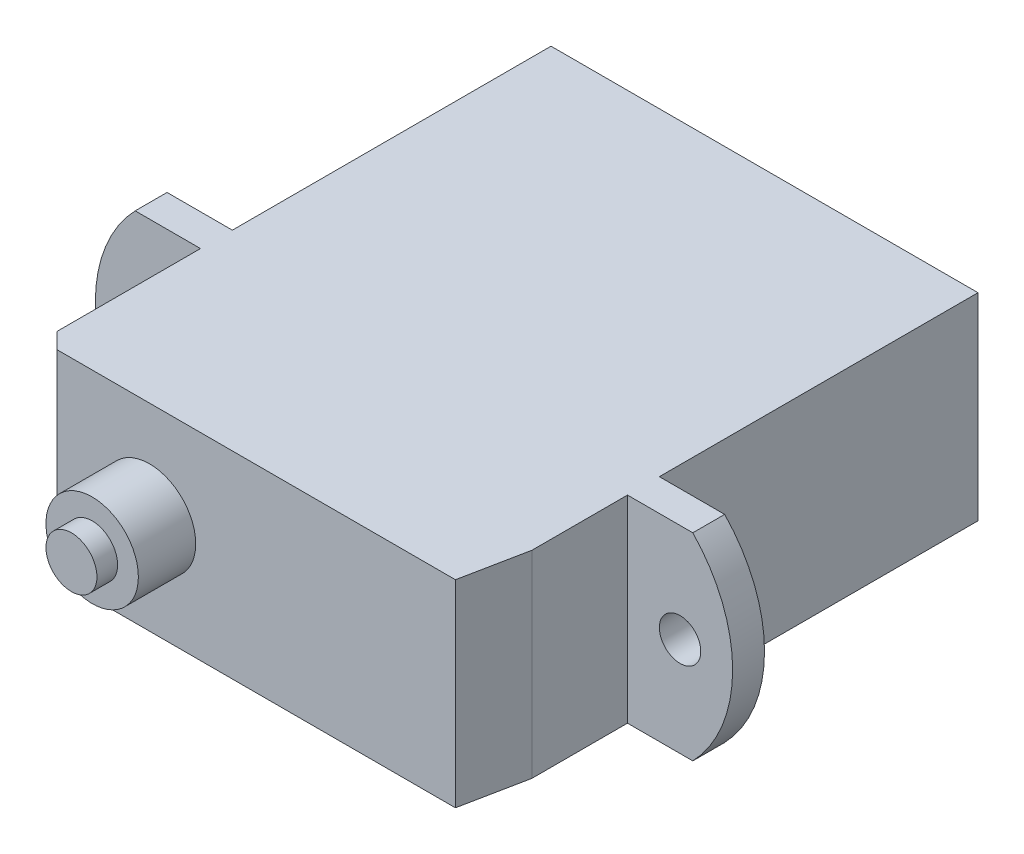
ISO-10303-21;
HEADER;
FILE_DESCRIPTION(('STEP AP214'),'2;1');
FILE_NAME('part.step','',(''),(''),'','','');
FILE_SCHEMA(('AUTOMOTIVE_DESIGN { 1 0 10303 214 1 1 1 1 }'));
ENDSEC;
DATA;
#1=APPLICATION_CONTEXT('core data for automotive mechanical design processes');
#2=APPLICATION_PROTOCOL_DEFINITION('international standard','automotive_design',2000,#1);
#3=PRODUCT_CONTEXT('',#1,'mechanical');
#4=PRODUCT('Part','Part','',(#3));
#5=PRODUCT_RELATED_PRODUCT_CATEGORY('part','',(#4));
#6=PRODUCT_DEFINITION_FORMATION('','',#4);
#7=PRODUCT_DEFINITION_CONTEXT('part definition',#1,'design');
#8=PRODUCT_DEFINITION('design','',#6,#7);
#9=PRODUCT_DEFINITION_SHAPE('','',#8);
#10=(LENGTH_UNIT() NAMED_UNIT(*) SI_UNIT(.MILLI.,.METRE.));
#11=(NAMED_UNIT(*) PLANE_ANGLE_UNIT() SI_UNIT($,.RADIAN.));
#12=(NAMED_UNIT(*) SI_UNIT($,.STERADIAN.) SOLID_ANGLE_UNIT());
#13=UNCERTAINTY_MEASURE_WITH_UNIT(LENGTH_MEASURE(1.E-05),#10,'distance_accuracy_value','');
#14=(GEOMETRIC_REPRESENTATION_CONTEXT(3) GLOBAL_UNCERTAINTY_ASSIGNED_CONTEXT((#13)) GLOBAL_UNIT_ASSIGNED_CONTEXT((#10,
#11,#12)) REPRESENTATION_CONTEXT('',''));
#15=CARTESIAN_POINT('',(0.,0.,0.));
#16=DIRECTION('',(0.,0.,1.));
#17=DIRECTION('',(1.,0.,0.));
#18=AXIS2_PLACEMENT_3D('',#15,#16,#17);
#19=CARTESIAN_POINT('',(-8.3,0.,0.3));
#20=DIRECTION('',(1.,0.,0.));
#21=DIRECTION('',(0.,0.,-1.));
#22=AXIS2_PLACEMENT_3D('',#19,#20,#21);
#23=PLANE('',#22);
#24=CARTESIAN_POINT('',(-8.3,0.,0.3));
#25=DIRECTION('',(-1.,0.,0.));
#26=DIRECTION('',(0.,0.,1.));
#27=AXIS2_PLACEMENT_3D('',#24,#25,#26);
#28=CIRCLE('',#27,0.3);
#29=CARTESIAN_POINT('',(-8.3,-0.3,0.299999999925));
#30=VERTEX_POINT('',#29);
#31=CARTESIAN_POINT('',(-8.3,0.3,0.3));
#32=VERTEX_POINT('',#31);
#33=EDGE_CURVE('E19',#30,#32,#28,.T.);
#34=ORIENTED_EDGE('',*,*,#33,.T.);
#35=CARTESIAN_POINT('',(-8.3,0.,0.3));
#36=DIRECTION('',(-1.,0.,0.));
#37=DIRECTION('',(0.,0.,1.));
#38=AXIS2_PLACEMENT_3D('',#35,#36,#37);
#39=CIRCLE('',#38,0.3);
#40=EDGE_CURVE('E64',#32,#30,#39,.T.);
#41=ORIENTED_EDGE('',*,*,#40,.T.);
#42=EDGE_LOOP('',(#34,#41));
#43=FACE_BOUND('',#42,.T.);
#44=ADVANCED_FACE('F16',(#43),#23,.F.);
#45=CARTESIAN_POINT('',(-8.3,0.6,0.3));
#46=DIRECTION('',(1.,0.,0.));
#47=DIRECTION('',(0.,0.,-1.));
#48=AXIS2_PLACEMENT_3D('',#45,#46,#47);
#49=PLANE('',#48);
#50=CARTESIAN_POINT('',(-8.3,0.599999999999999,0.3));
#51=DIRECTION('',(-1.,0.,0.));
#52=DIRECTION('',(0.,0.,1.));
#53=AXIS2_PLACEMENT_3D('',#50,#51,#52);
#54=CIRCLE('',#53,0.3);
#55=CARTESIAN_POINT('',(-8.3,0.299999999999999,0.3));
#56=VERTEX_POINT('',#55);
#57=EDGE_CURVE('E85',#56,#56,#54,.T.);
#58=ORIENTED_EDGE('',*,*,#57,.T.);
#59=EDGE_LOOP('',(#58));
#60=FACE_BOUND('',#59,.T.);
#61=ADVANCED_FACE('F745',(#60),#49,.F.);
#62=CARTESIAN_POINT('',(-7.3,0.,0.3));
#63=DIRECTION('',(-1.,0.,0.));
#64=DIRECTION('',(0.,0.,1.));
#65=AXIS2_PLACEMENT_3D('',#62,#63,#64);
#66=CYLINDRICAL_SURFACE('',#65,0.3);
#67=DIRECTION('',(-1.,0.,0.));
#68=VECTOR('',#67,1.);
#69=CARTESIAN_POINT('',(-7.3,-0.3,0.3));
#70=LINE('',#69,#68);
#71=CARTESIAN_POINT('',(-7.3,-0.3,0.299999999925));
#72=VERTEX_POINT('',#71);
#73=EDGE_CURVE('E76',#72,#30,#70,.T.);
#74=ORIENTED_EDGE('',*,*,#73,.F.);
#75=CARTESIAN_POINT('',(-7.3,0.,0.3));
#76=DIRECTION('',(-1.,0.,0.));
#77=DIRECTION('',(0.,0.,1.));
#78=AXIS2_PLACEMENT_3D('',#75,#76,#77);
#79=CIRCLE('',#78,0.3);
#80=CARTESIAN_POINT('',(-7.3,0.299999999999999,0.299999999925));
#81=VERTEX_POINT('',#80);
#82=EDGE_CURVE('E73',#81,#72,#79,.F.);
#83=ORIENTED_EDGE('',*,*,#82,.F.);
#84=DIRECTION('',(-1.,0.,0.));
#85=VECTOR('',#84,1.);
#86=CARTESIAN_POINT('',(-7.3,0.3,0.3));
#87=LINE('',#86,#85);
#88=EDGE_CURVE('E71',#81,#32,#87,.T.);
#89=ORIENTED_EDGE('',*,*,#88,.T.);
#90=ORIENTED_EDGE('',*,*,#33,.F.);
#91=EDGE_LOOP('',(#74,#83,#89,#90));
#92=FACE_BOUND('',#91,.T.);
#93=ADVANCED_FACE('F72',(#92),#66,.T.);
#94=CARTESIAN_POINT('',(-7.3,0.,0.3));
#95=DIRECTION('',(-1.,0.,0.));
#96=DIRECTION('',(0.,0.,1.));
#97=AXIS2_PLACEMENT_3D('',#94,#95,#96);
#98=CYLINDRICAL_SURFACE('',#97,0.3);
#99=ORIENTED_EDGE('',*,*,#40,.F.);
#100=ORIENTED_EDGE('',*,*,#88,.F.);
#101=CARTESIAN_POINT('',(-7.3,0.,0.3));
#102=DIRECTION('',(-1.,0.,0.));
#103=DIRECTION('',(0.,0.,1.));
#104=AXIS2_PLACEMENT_3D('',#101,#102,#103);
#105=CIRCLE('',#104,0.3);
#106=CARTESIAN_POINT('',(-7.3,0.,0.));
#107=VERTEX_POINT('',#106);
#108=EDGE_CURVE('E97',#107,#81,#105,.F.);
#109=ORIENTED_EDGE('',*,*,#108,.F.);
#110=CARTESIAN_POINT('',(-7.3,0.,0.3));
#111=DIRECTION('',(-1.,0.,0.));
#112=DIRECTION('',(0.,0.,1.));
#113=AXIS2_PLACEMENT_3D('',#110,#111,#112);
#114=CIRCLE('',#113,0.3);
#115=EDGE_CURVE('E88',#72,#107,#114,.F.);
#116=ORIENTED_EDGE('',*,*,#115,.F.);
#117=ORIENTED_EDGE('',*,*,#73,.T.);
#118=EDGE_LOOP('',(#99,#100,#109,#116,#117));
#119=FACE_BOUND('',#118,.T.);
#120=ADVANCED_FACE('F78',(#119),#98,.T.);
#121=CARTESIAN_POINT('',(-7.3,0.599999999999999,0.3));
#122=DIRECTION('',(-1.,0.,0.));
#123=DIRECTION('',(0.,0.,1.));
#124=AXIS2_PLACEMENT_3D('',#121,#122,#123);
#125=CYLINDRICAL_SURFACE('',#124,0.3);
#126=DIRECTION('',(-1.,0.,0.));
#127=VECTOR('',#126,1.);
#128=CARTESIAN_POINT('',(-7.3,0.299999999999999,0.3));
#129=LINE('',#128,#127);
#130=EDGE_CURVE('E82',#81,#56,#129,.T.);
#131=ORIENTED_EDGE('',*,*,#130,.T.);
#132=ORIENTED_EDGE('',*,*,#57,.F.);
#133=ORIENTED_EDGE('',*,*,#130,.F.);
#134=CARTESIAN_POINT('',(-7.3,0.599999999999999,0.3));
#135=DIRECTION('',(-1.,0.,0.));
#136=DIRECTION('',(0.,0.,1.));
#137=AXIS2_PLACEMENT_3D('',#134,#135,#136);
#138=CIRCLE('',#137,0.3);
#139=CARTESIAN_POINT('',(-7.3,0.599999999999999,0.));
#140=VERTEX_POINT('',#139);
#141=EDGE_CURVE('E92',#140,#81,#138,.F.);
#142=ORIENTED_EDGE('',*,*,#141,.F.);
#143=CARTESIAN_POINT('',(-7.3,0.599999999999999,0.3));
#144=DIRECTION('',(-1.,0.,0.));
#145=DIRECTION('',(0.,0.,1.));
#146=AXIS2_PLACEMENT_3D('',#143,#144,#145);
#147=CIRCLE('',#146,0.3);
#148=EDGE_CURVE('E99',#81,#140,#147,.F.);
#149=ORIENTED_EDGE('',*,*,#148,.F.);
#150=EDGE_LOOP('',(#131,#132,#133,#142,#149));
#151=FACE_BOUND('',#150,.T.);
#152=ADVANCED_FACE('F420',(#151),#125,.T.);
#153=CARTESIAN_POINT('',(-8.3,-0.6,0.3));
#154=DIRECTION('',(1.,0.,0.));
#155=DIRECTION('',(0.,0.,-1.));
#156=AXIS2_PLACEMENT_3D('',#153,#154,#155);
#157=PLANE('',#156);
#158=CARTESIAN_POINT('',(-8.3,-0.600000000000001,0.3));
#159=DIRECTION('',(-1.,0.,0.));
#160=DIRECTION('',(0.,0.,1.));
#161=AXIS2_PLACEMENT_3D('',#158,#159,#160);
#162=CIRCLE('',#161,0.3);
#163=CARTESIAN_POINT('',(-8.3,-0.300000000000001,0.3));
#164=VERTEX_POINT('',#163);
#165=EDGE_CURVE('E107',#164,#164,#162,.T.);
#166=ORIENTED_EDGE('',*,*,#165,.T.);
#167=EDGE_LOOP('',(#166));
#168=FACE_BOUND('',#167,.T.);
#169=ADVANCED_FACE('F418',(#168),#157,.F.);
#170=CARTESIAN_POINT('',(-7.3,0.,2.15));
#171=DIRECTION('',(-1.,0.,0.));
#172=DIRECTION('',(0.,0.,1.));
#173=AXIS2_PLACEMENT_3D('',#170,#171,#172);
#174=PLANE('',#173);
#175=DIRECTION('',(0.,1.,0.));
#176=VECTOR('',#175,1.);
#177=CARTESIAN_POINT('',(-7.3,0.,0.));
#178=LINE('',#177,#176);
#179=CARTESIAN_POINT('',(-7.3,-0.600000000000001,0.));
#180=VERTEX_POINT('',#179);
#181=EDGE_CURVE('E87',#107,#180,#178,.F.);
#182=ORIENTED_EDGE('',*,*,#181,.T.);
#183=CARTESIAN_POINT('',(-7.3,-0.600000000000001,0.3));
#184=DIRECTION('',(-1.,0.,0.));
#185=DIRECTION('',(0.,0.,1.));
#186=AXIS2_PLACEMENT_3D('',#183,#184,#185);
#187=CIRCLE('',#186,0.3);
#188=EDGE_CURVE('E25',#72,#180,#187,.T.);
#189=ORIENTED_EDGE('',*,*,#188,.F.);
#190=ORIENTED_EDGE('',*,*,#115,.T.);
#191=EDGE_LOOP('',(#182,#189,#190));
#192=FACE_BOUND('',#191,.T.);
#193=ADVANCED_FACE('F412',(#192),#174,.T.);
#194=CARTESIAN_POINT('',(0.,0.,0.));
#195=DIRECTION('',(0.,0.,1.));
#196=DIRECTION('',(1.,0.,0.));
#197=AXIS2_PLACEMENT_3D('',#194,#195,#196);
#198=PLANE('',#197);
#199=DIRECTION('',(1.,0.,0.));
#200=VECTOR('',#199,1.);
#201=CARTESIAN_POINT('',(0.,-3.1,0.));
#202=LINE('',#201,#200);
#203=CARTESIAN_POINT('',(-6.7,-3.1,0.));
#204=VERTEX_POINT('',#203);
#205=CARTESIAN_POINT('',(6.7,-3.1,0.));
#206=VERTEX_POINT('',#205);
#207=EDGE_CURVE('E91',#204,#206,#202,.T.);
#208=ORIENTED_EDGE('',*,*,#207,.F.);
#209=DIRECTION('',(0.,1.,0.));
#210=VECTOR('',#209,1.);
#211=CARTESIAN_POINT('',(-6.7,-3.1,0.));
#212=LINE('',#211,#210);
#213=CARTESIAN_POINT('',(-6.7,-1.375,0.));
#214=VERTEX_POINT('',#213);
#215=EDGE_CURVE('E294',#204,#214,#212,.T.);
#216=ORIENTED_EDGE('',*,*,#215,.T.);
#217=DIRECTION('',(1.,0.,0.));
#218=VECTOR('',#217,1.);
#219=CARTESIAN_POINT('',(0.,-1.375,0.));
#220=LINE('',#219,#218);
#221=CARTESIAN_POINT('',(-7.3,-1.375,0.));
#222=VERTEX_POINT('',#221);
#223=EDGE_CURVE('E121',#222,#214,#220,.T.);
#224=ORIENTED_EDGE('',*,*,#223,.F.);
#225=DIRECTION('',(0.,1.,0.));
#226=VECTOR('',#225,1.);
#227=CARTESIAN_POINT('',(-7.3,0.,0.));
#228=LINE('',#227,#226);
#229=EDGE_CURVE('E119',#180,#222,#228,.F.);
#230=ORIENTED_EDGE('',*,*,#229,.F.);
#231=ORIENTED_EDGE('',*,*,#181,.F.);
#232=DIRECTION('',(0.,1.,0.));
#233=VECTOR('',#232,1.);
#234=CARTESIAN_POINT('',(-7.3,0.,0.));
#235=LINE('',#234,#233);
#236=EDGE_CURVE('E116',#140,#107,#235,.F.);
#237=ORIENTED_EDGE('',*,*,#236,.F.);
#238=DIRECTION('',(0.,1.,0.));
#239=VECTOR('',#238,1.);
#240=CARTESIAN_POINT('',(-7.3,0.,0.));
#241=LINE('',#240,#239);
#242=CARTESIAN_POINT('',(-7.3,1.375,0.));
#243=VERTEX_POINT('',#242);
#244=EDGE_CURVE('E112',#243,#140,#241,.F.);
#245=ORIENTED_EDGE('',*,*,#244,.F.);
#246=DIRECTION('',(1.,0.,0.));
#247=VECTOR('',#246,1.);
#248=CARTESIAN_POINT('',(0.,1.375,0.));
#249=LINE('',#248,#247);
#250=CARTESIAN_POINT('',(-6.7,1.375,0.));
#251=VERTEX_POINT('',#250);
#252=EDGE_CURVE('E115',#251,#243,#249,.F.);
#253=ORIENTED_EDGE('',*,*,#252,.F.);
#254=DIRECTION('',(0.,1.,0.));
#255=VECTOR('',#254,1.);
#256=CARTESIAN_POINT('',(-6.7,-3.1,0.));
#257=LINE('',#256,#255);
#258=CARTESIAN_POINT('',(-6.7,3.1,0.));
#259=VERTEX_POINT('',#258);
#260=EDGE_CURVE('E287',#251,#259,#257,.T.);
#261=ORIENTED_EDGE('',*,*,#260,.T.);
#262=DIRECTION('',(-1.,0.,0.));
#263=VECTOR('',#262,1.);
#264=CARTESIAN_POINT('',(8.75000000000002,3.1,0.));
#265=LINE('',#264,#263);
#266=CARTESIAN_POINT('',(6.7,3.1,0.));
#267=VERTEX_POINT('',#266);
#268=EDGE_CURVE('E284',#267,#259,#265,.T.);
#269=ORIENTED_EDGE('',*,*,#268,.F.);
#270=DIRECTION('',(0.,1.,0.));
#271=VECTOR('',#270,1.);
#272=CARTESIAN_POINT('',(6.7,0.,0.));
#273=LINE('',#272,#271);
#274=EDGE_CURVE('E281',#206,#267,#273,.T.);
#275=ORIENTED_EDGE('',*,*,#274,.F.);
#276=EDGE_LOOP('',(#208,#216,#224,#230,#231,#237,#245,#253,#261,#269,#275));
#277=FACE_BOUND('',#276,.T.);
#278=ADVANCED_FACE('F311',(#277),#198,.F.);
#279=CARTESIAN_POINT('',(-7.3,0.,2.15));
#280=DIRECTION('',(-1.,0.,0.));
#281=DIRECTION('',(0.,0.,1.));
#282=AXIS2_PLACEMENT_3D('',#279,#280,#281);
#283=PLANE('',#282);
#284=DIRECTION('',(0.,0.,1.));
#285=VECTOR('',#284,1.);
#286=CARTESIAN_POINT('',(-7.3,1.375,4.3));
#287=LINE('',#286,#285);
#288=CARTESIAN_POINT('',(-7.3,1.375,4.3));
#289=VERTEX_POINT('',#288);
#290=EDGE_CURVE('E94',#243,#289,#287,.T.);
#291=ORIENTED_EDGE('',*,*,#290,.F.);
#292=ORIENTED_EDGE('',*,*,#244,.T.);
#293=ORIENTED_EDGE('',*,*,#141,.T.);
#294=ORIENTED_EDGE('',*,*,#82,.T.);
#295=CARTESIAN_POINT('',(-7.3,-0.600000000000001,0.3));
#296=DIRECTION('',(-1.,0.,0.));
#297=DIRECTION('',(0.,0.,1.));
#298=AXIS2_PLACEMENT_3D('',#295,#296,#297);
#299=CIRCLE('',#298,0.3);
#300=EDGE_CURVE('E11',#180,#72,#299,.T.);
#301=ORIENTED_EDGE('',*,*,#300,.F.);
#302=ORIENTED_EDGE('',*,*,#229,.T.);
#303=DIRECTION('',(0.,0.,-1.));
#304=VECTOR('',#303,1.);
#305=CARTESIAN_POINT('',(-7.3,-1.375,0.));
#306=LINE('',#305,#304);
#307=CARTESIAN_POINT('',(-7.3,-1.375,4.3));
#308=VERTEX_POINT('',#307);
#309=EDGE_CURVE('E96',#308,#222,#306,.T.);
#310=ORIENTED_EDGE('',*,*,#309,.F.);
#311=DIRECTION('',(0.,1.,0.));
#312=VECTOR('',#311,1.);
#313=CARTESIAN_POINT('',(-7.3,-1.375,4.3));
#314=LINE('',#313,#312);
#315=EDGE_CURVE('E100',#289,#308,#314,.F.);
#316=ORIENTED_EDGE('',*,*,#315,.F.);
#317=EDGE_LOOP('',(#291,#292,#293,#294,#301,#302,#310,#316));
#318=FACE_BOUND('',#317,.T.);
#319=ADVANCED_FACE('F407',(#318),#283,.T.);
#320=CARTESIAN_POINT('',(-7.3,0.,2.15));
#321=DIRECTION('',(-1.,0.,0.));
#322=DIRECTION('',(0.,0.,1.));
#323=AXIS2_PLACEMENT_3D('',#320,#321,#322);
#324=PLANE('',#323);
#325=ORIENTED_EDGE('',*,*,#236,.T.);
#326=ORIENTED_EDGE('',*,*,#108,.T.);
#327=ORIENTED_EDGE('',*,*,#148,.T.);
#328=EDGE_LOOP('',(#325,#326,#327));
#329=FACE_BOUND('',#328,.T.);
#330=ADVANCED_FACE('F444',(#329),#324,.T.);
#331=CARTESIAN_POINT('',(-6.7,1.375,4.3));
#332=DIRECTION('',(0.,1.,0.));
#333=DIRECTION('',(0.,0.,1.));
#334=AXIS2_PLACEMENT_3D('',#331,#332,#333);
#335=PLANE('',#334);
#336=ORIENTED_EDGE('',*,*,#290,.T.);
#337=DIRECTION('',(1.,0.,0.));
#338=VECTOR('',#337,1.);
#339=CARTESIAN_POINT('',(-6.7,1.375,4.3));
#340=LINE('',#339,#338);
#341=CARTESIAN_POINT('',(-6.7,1.375,4.3));
#342=VERTEX_POINT('',#341);
#343=EDGE_CURVE('E103',#289,#342,#340,.T.);
#344=ORIENTED_EDGE('',*,*,#343,.T.);
#345=DIRECTION('',(0.,0.,-1.));
#346=VECTOR('',#345,1.);
#347=CARTESIAN_POINT('',(-6.7,1.375,0.));
#348=LINE('',#347,#346);
#349=EDGE_CURVE('E270',#342,#251,#348,.T.);
#350=ORIENTED_EDGE('',*,*,#349,.T.);
#351=ORIENTED_EDGE('',*,*,#252,.T.);
#352=EDGE_LOOP('',(#336,#344,#350,#351));
#353=FACE_BOUND('',#352,.T.);
#354=ADVANCED_FACE('F447',(#353),#335,.T.);
#355=CARTESIAN_POINT('',(-6.7,-1.375,0.));
#356=DIRECTION('',(0.,-1.,0.));
#357=DIRECTION('',(0.,0.,-1.));
#358=AXIS2_PLACEMENT_3D('',#355,#356,#357);
#359=PLANE('',#358);
#360=ORIENTED_EDGE('',*,*,#309,.T.);
#361=ORIENTED_EDGE('',*,*,#223,.T.);
#362=DIRECTION('',(0.,0.,-1.));
#363=VECTOR('',#362,1.);
#364=CARTESIAN_POINT('',(-6.7,-1.375,0.));
#365=LINE('',#364,#363);
#366=CARTESIAN_POINT('',(-6.7,-1.375,4.3));
#367=VERTEX_POINT('',#366);
#368=EDGE_CURVE('E267',#214,#367,#365,.F.);
#369=ORIENTED_EDGE('',*,*,#368,.T.);
#370=DIRECTION('',(1.,0.,0.));
#371=VECTOR('',#370,1.);
#372=CARTESIAN_POINT('',(-6.7,-1.375,4.3));
#373=LINE('',#372,#371);
#374=EDGE_CURVE('E264',#367,#308,#373,.F.);
#375=ORIENTED_EDGE('',*,*,#374,.T.);
#376=EDGE_LOOP('',(#360,#361,#369,#375));
#377=FACE_BOUND('',#376,.T.);
#378=ADVANCED_FACE('F396',(#377),#359,.T.);
#379=CARTESIAN_POINT('',(-6.7,-1.375,4.3));
#380=DIRECTION('',(0.,0.,1.));
#381=DIRECTION('',(1.,0.,0.));
#382=AXIS2_PLACEMENT_3D('',#379,#380,#381);
#383=PLANE('',#382);
#384=ORIENTED_EDGE('',*,*,#315,.T.);
#385=ORIENTED_EDGE('',*,*,#374,.F.);
#386=DIRECTION('',(0.,1.,0.));
#387=VECTOR('',#386,1.);
#388=CARTESIAN_POINT('',(-6.7,-3.1,4.3));
#389=LINE('',#388,#387);
#390=EDGE_CURVE('E261',#367,#342,#389,.T.);
#391=ORIENTED_EDGE('',*,*,#390,.T.);
#392=ORIENTED_EDGE('',*,*,#343,.F.);
#393=EDGE_LOOP('',(#384,#385,#391,#392));
#394=FACE_BOUND('',#393,.T.);
#395=ADVANCED_FACE('F404',(#394),#383,.T.);
#396=CARTESIAN_POINT('',(-8.75,-3.1,0.));
#397=DIRECTION('',(0.,-1.,0.));
#398=DIRECTION('',(0.,0.,-1.));
#399=AXIS2_PLACEMENT_3D('',#396,#397,#398);
#400=PLANE('',#399);
#401=DIRECTION('',(-0.196116135138184,0.,0.98058067569092));
#402=VECTOR('',#401,1.);
#403=CARTESIAN_POINT('',(6.3,-3.1,16.));
#404=LINE('',#403,#402);
#405=CARTESIAN_POINT('',(6.7,-3.1,14.));
#406=VERTEX_POINT('',#405);
#407=CARTESIAN_POINT('',(6.3,-3.1,16.));
#408=VERTEX_POINT('',#407);
#409=EDGE_CURVE('E258',#406,#408,#404,.T.);
#410=ORIENTED_EDGE('',*,*,#409,.T.);
#411=DIRECTION('',(1.,0.,0.));
#412=VECTOR('',#411,1.);
#413=CARTESIAN_POINT('',(0.,-3.1,16.));
#414=LINE('',#413,#412);
#415=CARTESIAN_POINT('',(-6.2,-3.1,16.));
#416=VERTEX_POINT('',#415);
#417=EDGE_CURVE('E255',#416,#408,#414,.T.);
#418=ORIENTED_EDGE('',*,*,#417,.F.);
#419=DIRECTION('',(-0.707106781186547,0.,-0.707106781186548));
#420=VECTOR('',#419,1.);
#421=CARTESIAN_POINT('',(-6.2,-3.1,16.));
#422=LINE('',#421,#420);
#423=CARTESIAN_POINT('',(-6.7,-3.1,15.5));
#424=VERTEX_POINT('',#423);
#425=EDGE_CURVE('E252',#416,#424,#422,.T.);
#426=ORIENTED_EDGE('',*,*,#425,.T.);
#427=DIRECTION('',(0.,0.,1.));
#428=VECTOR('',#427,1.);
#429=CARTESIAN_POINT('',(-6.7,-3.1,16.));
#430=LINE('',#429,#428);
#431=CARTESIAN_POINT('',(-6.7,-3.1,11.));
#432=VERTEX_POINT('',#431);
#433=EDGE_CURVE('E249',#432,#424,#430,.T.);
#434=ORIENTED_EDGE('',*,*,#433,.F.);
#435=DIRECTION('',(1.,0.,0.));
#436=VECTOR('',#435,1.);
#437=CARTESIAN_POINT('',(7.92913411917328,-3.1,11.));
#438=LINE('',#437,#436);
#439=CARTESIAN_POINT('',(-8.75,-3.1,11.));
#440=VERTEX_POINT('',#439);
#441=EDGE_CURVE('E246',#440,#432,#438,.T.);
#442=ORIENTED_EDGE('',*,*,#441,.F.);
#443=DIRECTION('',(0.,0.,-1.));
#444=VECTOR('',#443,1.);
#445=CARTESIAN_POINT('',(-8.75,-3.1,0.));
#446=LINE('',#445,#444);
#447=CARTESIAN_POINT('',(-8.75,-3.1,10.));
#448=VERTEX_POINT('',#447);
#449=EDGE_CURVE('E243',#440,#448,#446,.T.);
#450=ORIENTED_EDGE('',*,*,#449,.T.);
#451=DIRECTION('',(1.,0.,0.));
#452=VECTOR('',#451,1.);
#453=CARTESIAN_POINT('',(-7.92913411917328,-3.1,10.));
#454=LINE('',#453,#452);
#455=CARTESIAN_POINT('',(-6.7,-3.1,10.));
#456=VERTEX_POINT('',#455);
#457=EDGE_CURVE('E240',#448,#456,#454,.T.);
#458=ORIENTED_EDGE('',*,*,#457,.T.);
#459=DIRECTION('',(0.,0.,-1.));
#460=VECTOR('',#459,1.);
#461=CARTESIAN_POINT('',(-6.7,-3.1,0.));
#462=LINE('',#461,#460);
#463=EDGE_CURVE('E237',#456,#204,#462,.T.);
#464=ORIENTED_EDGE('',*,*,#463,.T.);
#465=ORIENTED_EDGE('',*,*,#207,.T.);
#466=DIRECTION('',(0.,0.,1.));
#467=VECTOR('',#466,1.);
#468=CARTESIAN_POINT('',(6.7,-3.1,0.));
#469=LINE('',#468,#467);
#470=CARTESIAN_POINT('',(6.7,-3.1,10.));
#471=VERTEX_POINT('',#470);
#472=EDGE_CURVE('E234',#206,#471,#469,.T.);
#473=ORIENTED_EDGE('',*,*,#472,.T.);
#474=DIRECTION('',(1.,0.,0.));
#475=VECTOR('',#474,1.);
#476=CARTESIAN_POINT('',(7.92913411917328,-3.1,10.));
#477=LINE('',#476,#475);
#478=CARTESIAN_POINT('',(8.75,-3.1,10.));
#479=VERTEX_POINT('',#478);
#480=EDGE_CURVE('E231',#471,#479,#477,.T.);
#481=ORIENTED_EDGE('',*,*,#480,.T.);
#482=DIRECTION('',(0.,0.,-1.));
#483=VECTOR('',#482,1.);
#484=CARTESIAN_POINT('',(8.75,-3.1,0.));
#485=LINE('',#484,#483);
#486=CARTESIAN_POINT('',(8.75,-3.1,11.));
#487=VERTEX_POINT('',#486);
#488=EDGE_CURVE('E228',#479,#487,#485,.F.);
#489=ORIENTED_EDGE('',*,*,#488,.T.);
#490=DIRECTION('',(1.,0.,0.));
#491=VECTOR('',#490,1.);
#492=CARTESIAN_POINT('',(7.92913411917328,-3.1,11.));
#493=LINE('',#492,#491);
#494=CARTESIAN_POINT('',(6.7,-3.1,11.));
#495=VERTEX_POINT('',#494);
#496=EDGE_CURVE('E225',#495,#487,#493,.T.);
#497=ORIENTED_EDGE('',*,*,#496,.F.);
#498=DIRECTION('',(0.,0.,-1.));
#499=VECTOR('',#498,1.);
#500=CARTESIAN_POINT('',(6.7,-3.1,16.));
#501=LINE('',#500,#499);
#502=EDGE_CURVE('E222',#406,#495,#501,.T.);
#503=ORIENTED_EDGE('',*,*,#502,.F.);
#504=EDGE_LOOP('',(#410,#418,#426,#434,#442,#450,#458,#464,#465,#473,#481,#489,#497,#503));
#505=FACE_BOUND('',#504,.T.);
#506=ADVANCED_FACE('F301',(#505),#400,.T.);
#507=CARTESIAN_POINT('',(-6.7,-3.1,0.));
#508=DIRECTION('',(1.,0.,0.));
#509=DIRECTION('',(0.,0.,-1.));
#510=AXIS2_PLACEMENT_3D('',#507,#508,#509);
#511=PLANE('',#510);
#512=ORIENTED_EDGE('',*,*,#215,.F.);
#513=ORIENTED_EDGE('',*,*,#463,.F.);
#514=DIRECTION('',(0.,1.,0.));
#515=VECTOR('',#514,1.);
#516=CARTESIAN_POINT('',(-6.7,0.,10.));
#517=LINE('',#516,#515);
#518=CARTESIAN_POINT('',(-6.7,3.1,10.));
#519=VERTEX_POINT('',#518);
#520=EDGE_CURVE('E219',#456,#519,#517,.T.);
#521=ORIENTED_EDGE('',*,*,#520,.T.);
#522=DIRECTION('',(0.,0.,1.));
#523=VECTOR('',#522,1.);
#524=CARTESIAN_POINT('',(-6.7,3.1,0.));
#525=LINE('',#524,#523);
#526=EDGE_CURVE('E216',#259,#519,#525,.T.);
#527=ORIENTED_EDGE('',*,*,#526,.F.);
#528=ORIENTED_EDGE('',*,*,#260,.F.);
#529=ORIENTED_EDGE('',*,*,#349,.F.);
#530=ORIENTED_EDGE('',*,*,#390,.F.);
#531=ORIENTED_EDGE('',*,*,#368,.F.);
#532=EDGE_LOOP('',(#512,#513,#521,#527,#528,#529,#530,#531));
#533=FACE_BOUND('',#532,.T.);
#534=ADVANCED_FACE('F399',(#533),#511,.F.);
#535=CARTESIAN_POINT('',(8.75000000000002,3.1,0.));
#536=DIRECTION('',(0.,1.,0.));
#537=DIRECTION('',(-1.,0.,0.));
#538=AXIS2_PLACEMENT_3D('',#535,#536,#537);
#539=PLANE('',#538);
#540=DIRECTION('',(-1.,0.,0.));
#541=VECTOR('',#540,1.);
#542=CARTESIAN_POINT('',(8.75000000000002,3.1,11.));
#543=LINE('',#542,#541);
#544=CARTESIAN_POINT('',(-8.75,3.1,11.));
#545=VERTEX_POINT('',#544);
#546=CARTESIAN_POINT('',(-6.7,3.1,11.));
#547=VERTEX_POINT('',#546);
#548=EDGE_CURVE('E213',#545,#547,#543,.F.);
#549=ORIENTED_EDGE('',*,*,#548,.T.);
#550=DIRECTION('',(0.,0.,1.));
#551=VECTOR('',#550,1.);
#552=CARTESIAN_POINT('',(-6.7,3.1,0.));
#553=LINE('',#552,#551);
#554=CARTESIAN_POINT('',(-6.7,3.1,15.5));
#555=VERTEX_POINT('',#554);
#556=EDGE_CURVE('E210',#547,#555,#553,.T.);
#557=ORIENTED_EDGE('',*,*,#556,.T.);
#558=DIRECTION('',(0.707106781186549,0.,0.707106781186546));
#559=VECTOR('',#558,1.);
#560=CARTESIAN_POINT('',(-6.45,3.1,15.75));
#561=LINE('',#560,#559);
#562=CARTESIAN_POINT('',(-6.2,3.1,16.));
#563=VERTEX_POINT('',#562);
#564=EDGE_CURVE('E207',#563,#555,#561,.F.);
#565=ORIENTED_EDGE('',*,*,#564,.F.);
#566=DIRECTION('',(-1.,0.,0.));
#567=VECTOR('',#566,1.);
#568=CARTESIAN_POINT('',(8.75000000000002,3.1,16.));
#569=LINE('',#568,#567);
#570=CARTESIAN_POINT('',(6.3,3.1,16.));
#571=VERTEX_POINT('',#570);
#572=EDGE_CURVE('E204',#563,#571,#569,.F.);
#573=ORIENTED_EDGE('',*,*,#572,.T.);
#574=DIRECTION('',(0.196116135138184,0.,-0.98058067569092));
#575=VECTOR('',#574,1.);
#576=CARTESIAN_POINT('',(6.3,3.1,16.));
#577=LINE('',#576,#575);
#578=CARTESIAN_POINT('',(6.7,3.1,14.));
#579=VERTEX_POINT('',#578);
#580=EDGE_CURVE('E201',#571,#579,#577,.T.);
#581=ORIENTED_EDGE('',*,*,#580,.T.);
#582=DIRECTION('',(0.,0.,1.));
#583=VECTOR('',#582,1.);
#584=CARTESIAN_POINT('',(6.7,3.1,0.));
#585=LINE('',#584,#583);
#586=CARTESIAN_POINT('',(6.7,3.1,11.));
#587=VERTEX_POINT('',#586);
#588=EDGE_CURVE('E198',#579,#587,#585,.F.);
#589=ORIENTED_EDGE('',*,*,#588,.T.);
#590=DIRECTION('',(-1.,0.,0.));
#591=VECTOR('',#590,1.);
#592=CARTESIAN_POINT('',(8.75000000000002,3.1,11.));
#593=LINE('',#592,#591);
#594=CARTESIAN_POINT('',(8.75,3.1,11.));
#595=VERTEX_POINT('',#594);
#596=EDGE_CURVE('E195',#587,#595,#593,.F.);
#597=ORIENTED_EDGE('',*,*,#596,.T.);
#598=DIRECTION('',(0.,0.,1.));
#599=VECTOR('',#598,1.);
#600=CARTESIAN_POINT('',(8.75000000000001,3.09999999999999,0.));
#601=LINE('',#600,#599);
#602=CARTESIAN_POINT('',(8.75,3.1,10.));
#603=VERTEX_POINT('',#602);
#604=EDGE_CURVE('E192',#603,#595,#601,.T.);
#605=ORIENTED_EDGE('',*,*,#604,.F.);
#606=DIRECTION('',(-1.,0.,0.));
#607=VECTOR('',#606,1.);
#608=CARTESIAN_POINT('',(8.75000000000002,3.1,10.));
#609=LINE('',#608,#607);
#610=CARTESIAN_POINT('',(6.7,3.1,10.));
#611=VERTEX_POINT('',#610);
#612=EDGE_CURVE('E189',#603,#611,#609,.T.);
#613=ORIENTED_EDGE('',*,*,#612,.T.);
#614=DIRECTION('',(0.,0.,1.));
#615=VECTOR('',#614,1.);
#616=CARTESIAN_POINT('',(6.7,3.1,0.));
#617=LINE('',#616,#615);
#618=EDGE_CURVE('E186',#611,#267,#617,.F.);
#619=ORIENTED_EDGE('',*,*,#618,.T.);
#620=ORIENTED_EDGE('',*,*,#268,.T.);
#621=ORIENTED_EDGE('',*,*,#526,.T.);
#622=DIRECTION('',(-1.,0.,0.));
#623=VECTOR('',#622,1.);
#624=CARTESIAN_POINT('',(8.75000000000002,3.1,10.));
#625=LINE('',#624,#623);
#626=CARTESIAN_POINT('',(-8.75,3.1,10.));
#627=VERTEX_POINT('',#626);
#628=EDGE_CURVE('E183',#519,#627,#625,.T.);
#629=ORIENTED_EDGE('',*,*,#628,.T.);
#630=DIRECTION('',(0.,0.,1.));
#631=VECTOR('',#630,1.);
#632=CARTESIAN_POINT('',(-8.75,3.1,0.));
#633=LINE('',#632,#631);
#634=EDGE_CURVE('E180',#545,#627,#633,.F.);
#635=ORIENTED_EDGE('',*,*,#634,.F.);
#636=EDGE_LOOP('',(#549,#557,#565,#573,#581,#589,#597,#605,#613,#619,#620,#621,#629,#635));
#637=FACE_BOUND('',#636,.T.);
#638=ADVANCED_FACE('F460',(#637),#539,.T.);
#639=CARTESIAN_POINT('',(6.7,3.1,0.));
#640=DIRECTION('',(-1.,0.,0.));
#641=DIRECTION('',(0.,0.,1.));
#642=AXIS2_PLACEMENT_3D('',#639,#640,#641);
#643=PLANE('',#642);
#644=ORIENTED_EDGE('',*,*,#618,.F.);
#645=DIRECTION('',(0.,1.,0.));
#646=VECTOR('',#645,1.);
#647=CARTESIAN_POINT('',(6.7,3.1,10.));
#648=LINE('',#647,#646);
#649=EDGE_CURVE('E177',#471,#611,#648,.T.);
#650=ORIENTED_EDGE('',*,*,#649,.F.);
#651=ORIENTED_EDGE('',*,*,#472,.F.);
#652=ORIENTED_EDGE('',*,*,#274,.T.);
#653=EDGE_LOOP('',(#644,#650,#651,#652));
#654=FACE_BOUND('',#653,.T.);
#655=ADVANCED_FACE('F315',(#654),#643,.F.);
#656=CARTESIAN_POINT('',(-6.7,-3.1,16.));
#657=DIRECTION('',(-1.,0.,0.));
#658=DIRECTION('',(0.,0.,1.));
#659=AXIS2_PLACEMENT_3D('',#656,#657,#658);
#660=PLANE('',#659);
#661=DIRECTION('',(0.,1.,0.));
#662=VECTOR('',#661,1.);
#663=CARTESIAN_POINT('',(-6.7,-3.1,11.));
#664=LINE('',#663,#662);
#665=EDGE_CURVE('E174',#547,#432,#664,.F.);
#666=ORIENTED_EDGE('',*,*,#665,.T.);
#667=ORIENTED_EDGE('',*,*,#433,.T.);
#668=DIRECTION('',(0.,1.,0.));
#669=VECTOR('',#668,1.);
#670=CARTESIAN_POINT('',(-6.7,-3.1,15.5));
#671=LINE('',#670,#669);
#672=EDGE_CURVE('E171',#424,#555,#671,.T.);
#673=ORIENTED_EDGE('',*,*,#672,.T.);
#674=ORIENTED_EDGE('',*,*,#556,.F.);
#675=EDGE_LOOP('',(#666,#667,#673,#674));
#676=FACE_BOUND('',#675,.T.);
#677=ADVANCED_FACE('F465',(#676),#660,.T.);
#678=CARTESIAN_POINT('',(7.92913411917328,0.,11.));
#679=DIRECTION('',(0.,0.,1.));
#680=DIRECTION('',(1.,0.,0.));
#681=AXIS2_PLACEMENT_3D('',#678,#679,#680);
#682=PLANE('',#681);
#683=CARTESIAN_POINT('',(-8.35,0.,11.));
#684=DIRECTION('',(0.,0.,-1.));
#685=DIRECTION('',(-1.,0.,0.));
#686=AXIS2_PLACEMENT_3D('',#683,#684,#685);
#687=CIRCLE('',#686,0.65);
#688=CARTESIAN_POINT('',(-9.,0.,11.));
#689=VERTEX_POINT('',#688);
#690=EDGE_CURVE('E168',#689,#689,#687,.T.);
#691=ORIENTED_EDGE('',*,*,#690,.T.);
#692=EDGE_LOOP('',(#691));
#693=FACE_BOUND('',#692,.T.);
#694=CARTESIAN_POINT('',(-5.531,0.,11.));
#695=DIRECTION('',(0.,0.,1.));
#696=DIRECTION('',(1.,0.,0.));
#697=AXIS2_PLACEMENT_3D('',#694,#695,#696);
#698=CIRCLE('',#697,4.469);
#699=EDGE_CURVE('E165',#545,#440,#698,.T.);
#700=ORIENTED_EDGE('',*,*,#699,.T.);
#701=ORIENTED_EDGE('',*,*,#441,.T.);
#702=ORIENTED_EDGE('',*,*,#665,.F.);
#703=ORIENTED_EDGE('',*,*,#548,.F.);
#704=EDGE_LOOP('',(#700,#701,#702,#703));
#705=FACE_BOUND('',#704,.T.);
#706=ADVANCED_FACE('F468',(#693,#705),#682,.T.);
#707=CARTESIAN_POINT('',(-7.92913411917328,0.,10.));
#708=DIRECTION('',(0.,0.,1.));
#709=DIRECTION('',(1.,0.,0.));
#710=AXIS2_PLACEMENT_3D('',#707,#708,#709);
#711=PLANE('',#710);
#712=CARTESIAN_POINT('',(-8.35,0.,10.));
#713=DIRECTION('',(0.,0.,-1.));
#714=DIRECTION('',(-1.,0.,0.));
#715=AXIS2_PLACEMENT_3D('',#712,#713,#714);
#716=CIRCLE('',#715,0.65);
#717=CARTESIAN_POINT('',(-9.,0.,10.));
#718=VERTEX_POINT('',#717);
#719=EDGE_CURVE('E162',#718,#718,#716,.T.);
#720=ORIENTED_EDGE('',*,*,#719,.F.);
#721=EDGE_LOOP('',(#720));
#722=FACE_BOUND('',#721,.T.);
#723=ORIENTED_EDGE('',*,*,#457,.F.);
#724=CARTESIAN_POINT('',(-5.531,0.,10.));
#725=DIRECTION('',(0.,0.,1.));
#726=DIRECTION('',(1.,0.,0.));
#727=AXIS2_PLACEMENT_3D('',#724,#725,#726);
#728=CIRCLE('',#727,4.469);
#729=EDGE_CURVE('E159',#627,#448,#728,.T.);
#730=ORIENTED_EDGE('',*,*,#729,.F.);
#731=ORIENTED_EDGE('',*,*,#628,.F.);
#732=ORIENTED_EDGE('',*,*,#520,.F.);
#733=EDGE_LOOP('',(#723,#730,#731,#732));
#734=FACE_BOUND('',#733,.T.);
#735=ADVANCED_FACE('F472',(#722,#734),#711,.F.);
#736=CARTESIAN_POINT('',(7.92913411917328,0.,10.));
#737=DIRECTION('',(0.,0.,1.));
#738=DIRECTION('',(1.,0.,0.));
#739=AXIS2_PLACEMENT_3D('',#736,#737,#738);
#740=PLANE('',#739);
#741=CARTESIAN_POINT('',(8.35,0.,10.));
#742=DIRECTION('',(0.,0.,-1.));
#743=DIRECTION('',(-1.,0.,0.));
#744=AXIS2_PLACEMENT_3D('',#741,#742,#743);
#745=CIRCLE('',#744,0.65);
#746=CARTESIAN_POINT('',(7.7,0.,10.));
#747=VERTEX_POINT('',#746);
#748=EDGE_CURVE('E156',#747,#747,#745,.T.);
#749=ORIENTED_EDGE('',*,*,#748,.F.);
#750=EDGE_LOOP('',(#749));
#751=FACE_BOUND('',#750,.T.);
#752=ORIENTED_EDGE('',*,*,#612,.F.);
#753=CARTESIAN_POINT('',(5.531,0.,10.));
#754=DIRECTION('',(0.,0.,1.));
#755=DIRECTION('',(1.,0.,0.));
#756=AXIS2_PLACEMENT_3D('',#753,#754,#755);
#757=CIRCLE('',#756,4.469);
#758=EDGE_CURVE('E153',#479,#603,#757,.T.);
#759=ORIENTED_EDGE('',*,*,#758,.F.);
#760=ORIENTED_EDGE('',*,*,#480,.F.);
#761=ORIENTED_EDGE('',*,*,#649,.T.);
#762=EDGE_LOOP('',(#752,#759,#760,#761));
#763=FACE_BOUND('',#762,.T.);
#764=ADVANCED_FACE('F322',(#751,#763),#740,.F.);
#765=CARTESIAN_POINT('',(7.92913411917328,0.,11.));
#766=DIRECTION('',(0.,0.,1.));
#767=DIRECTION('',(1.,0.,0.));
#768=AXIS2_PLACEMENT_3D('',#765,#766,#767);
#769=PLANE('',#768);
#770=CARTESIAN_POINT('',(8.35,0.,11.));
#771=DIRECTION('',(0.,0.,-1.));
#772=DIRECTION('',(-1.,0.,0.));
#773=AXIS2_PLACEMENT_3D('',#770,#771,#772);
#774=CIRCLE('',#773,0.65);
#775=CARTESIAN_POINT('',(7.7,0.,11.));
#776=VERTEX_POINT('',#775);
#777=EDGE_CURVE('E150',#776,#776,#774,.T.);
#778=ORIENTED_EDGE('',*,*,#777,.T.);
#779=EDGE_LOOP('',(#778));
#780=FACE_BOUND('',#779,.T.);
#781=CARTESIAN_POINT('',(5.531,0.,11.));
#782=DIRECTION('',(0.,0.,1.));
#783=DIRECTION('',(1.,0.,0.));
#784=AXIS2_PLACEMENT_3D('',#781,#782,#783);
#785=CIRCLE('',#784,4.469);
#786=EDGE_CURVE('E147',#487,#595,#785,.T.);
#787=ORIENTED_EDGE('',*,*,#786,.T.);
#788=ORIENTED_EDGE('',*,*,#596,.F.);
#789=DIRECTION('',(0.,1.,0.));
#790=VECTOR('',#789,1.);
#791=CARTESIAN_POINT('',(6.7,0.,11.));
#792=LINE('',#791,#790);
#793=EDGE_CURVE('E144',#587,#495,#792,.F.);
#794=ORIENTED_EDGE('',*,*,#793,.T.);
#795=ORIENTED_EDGE('',*,*,#496,.T.);
#796=EDGE_LOOP('',(#787,#788,#794,#795));
#797=FACE_BOUND('',#796,.T.);
#798=ADVANCED_FACE('F479',(#780,#797),#769,.T.);
#799=CARTESIAN_POINT('',(6.7,3.1,16.));
#800=DIRECTION('',(1.,0.,0.));
#801=DIRECTION('',(0.,0.,-1.));
#802=AXIS2_PLACEMENT_3D('',#799,#800,#801);
#803=PLANE('',#802);
#804=ORIENTED_EDGE('',*,*,#793,.F.);
#805=ORIENTED_EDGE('',*,*,#588,.F.);
#806=DIRECTION('',(0.,1.,0.));
#807=VECTOR('',#806,1.);
#808=CARTESIAN_POINT('',(6.7,3.1,14.));
#809=LINE('',#808,#807);
#810=EDGE_CURVE('E141',#579,#406,#809,.F.);
#811=ORIENTED_EDGE('',*,*,#810,.T.);
#812=ORIENTED_EDGE('',*,*,#502,.T.);
#813=EDGE_LOOP('',(#804,#805,#811,#812));
#814=FACE_BOUND('',#813,.T.);
#815=ADVANCED_FACE('F483',(#814),#803,.T.);
#816=CARTESIAN_POINT('',(6.3,3.1,16.));
#817=DIRECTION('',(-0.98058067569092,0.,-0.196116135138184));
#818=DIRECTION('',(-0.196116135138184,0.,0.98058067569092));
#819=AXIS2_PLACEMENT_3D('',#816,#817,#818);
#820=PLANE('',#819);
#821=ORIENTED_EDGE('',*,*,#810,.F.);
#822=ORIENTED_EDGE('',*,*,#580,.F.);
#823=DIRECTION('',(0.,1.,0.));
#824=VECTOR('',#823,1.);
#825=CARTESIAN_POINT('',(6.3,3.1,16.));
#826=LINE('',#825,#824);
#827=EDGE_CURVE('E138',#408,#571,#826,.T.);
#828=ORIENTED_EDGE('',*,*,#827,.F.);
#829=ORIENTED_EDGE('',*,*,#409,.F.);
#830=EDGE_LOOP('',(#821,#822,#828,#829));
#831=FACE_BOUND('',#830,.T.);
#832=ADVANCED_FACE('F487',(#831),#820,.F.);
#833=CARTESIAN_POINT('',(0.,0.,16.));
#834=DIRECTION('',(0.,0.,1.));
#835=DIRECTION('',(1.,0.,0.));
#836=AXIS2_PLACEMENT_3D('',#833,#834,#835);
#837=PLANE('',#836);
#838=CARTESIAN_POINT('',(-3.3,0.,16.));
#839=DIRECTION('',(0.,0.,1.));
#840=DIRECTION('',(1.,0.,0.));
#841=AXIS2_PLACEMENT_3D('',#838,#839,#840);
#842=CIRCLE('',#841,1.45);
#843=CARTESIAN_POINT('',(-1.85,0.,16.));
#844=VERTEX_POINT('',#843);
#845=EDGE_CURVE('E135',#844,#844,#842,.F.);
#846=ORIENTED_EDGE('',*,*,#845,.T.);
#847=EDGE_LOOP('',(#846));
#848=FACE_BOUND('',#847,.T.);
#849=ORIENTED_EDGE('',*,*,#827,.T.);
#850=ORIENTED_EDGE('',*,*,#572,.F.);
#851=DIRECTION('',(0.,1.,0.));
#852=VECTOR('',#851,1.);
#853=CARTESIAN_POINT('',(-6.2,0.,16.));
#854=LINE('',#853,#852);
#855=EDGE_CURVE('E132',#563,#416,#854,.F.);
#856=ORIENTED_EDGE('',*,*,#855,.T.);
#857=ORIENTED_EDGE('',*,*,#417,.T.);
#858=EDGE_LOOP('',(#849,#850,#856,#857));
#859=FACE_BOUND('',#858,.T.);
#860=ADVANCED_FACE('F491',(#848,#859),#837,.T.);
#861=CARTESIAN_POINT('',(-6.45,-1.55,15.75));
#862=DIRECTION('',(-0.707106781186546,0.,0.707106781186549));
#863=DIRECTION('',(0.707106781186549,0.,0.707106781186546));
#864=AXIS2_PLACEMENT_3D('',#861,#862,#863);
#865=PLANE('',#864);
#866=ORIENTED_EDGE('',*,*,#564,.T.);
#867=ORIENTED_EDGE('',*,*,#672,.F.);
#868=ORIENTED_EDGE('',*,*,#425,.F.);
#869=ORIENTED_EDGE('',*,*,#855,.F.);
#870=EDGE_LOOP('',(#866,#867,#868,#869));
#871=FACE_BOUND('',#870,.T.);
#872=ADVANCED_FACE('F495',(#871),#865,.T.);
#873=CARTESIAN_POINT('',(-8.35,0.,11.));
#874=DIRECTION('',(0.,0.,-1.));
#875=DIRECTION('',(-1.,0.,0.));
#876=AXIS2_PLACEMENT_3D('',#873,#874,#875);
#877=CYLINDRICAL_SURFACE('',#876,0.65);
#878=ORIENTED_EDGE('',*,*,#719,.T.);
#879=EDGE_LOOP('',(#878));
#880=FACE_BOUND('',#879,.T.);
#881=ORIENTED_EDGE('',*,*,#690,.F.);
#882=EDGE_LOOP('',(#881));
#883=FACE_BOUND('',#882,.T.);
#884=ADVANCED_FACE('F499',(#880,#883),#877,.F.);
#885=CARTESIAN_POINT('',(-5.531,0.,0.));
#886=DIRECTION('',(0.,0.,1.));
#887=DIRECTION('',(1.,0.,0.));
#888=AXIS2_PLACEMENT_3D('',#885,#886,#887);
#889=CYLINDRICAL_SURFACE('',#888,4.469);
#890=ORIENTED_EDGE('',*,*,#699,.F.);
#891=ORIENTED_EDGE('',*,*,#634,.T.);
#892=ORIENTED_EDGE('',*,*,#729,.T.);
#893=ORIENTED_EDGE('',*,*,#449,.F.);
#894=EDGE_LOOP('',(#890,#891,#892,#893));
#895=FACE_BOUND('',#894,.T.);
#896=ADVANCED_FACE('F503',(#895),#889,.T.);
#897=CARTESIAN_POINT('',(8.35,0.,11.));
#898=DIRECTION('',(0.,0.,-1.));
#899=DIRECTION('',(-1.,0.,0.));
#900=AXIS2_PLACEMENT_3D('',#897,#898,#899);
#901=CYLINDRICAL_SURFACE('',#900,0.65);
#902=ORIENTED_EDGE('',*,*,#748,.T.);
#903=EDGE_LOOP('',(#902));
#904=FACE_BOUND('',#903,.T.);
#905=ORIENTED_EDGE('',*,*,#777,.F.);
#906=EDGE_LOOP('',(#905));
#907=FACE_BOUND('',#906,.T.);
#908=ADVANCED_FACE('F507',(#904,#907),#901,.F.);
#909=CARTESIAN_POINT('',(5.531,0.,0.));
#910=DIRECTION('',(0.,0.,1.));
#911=DIRECTION('',(1.,0.,0.));
#912=AXIS2_PLACEMENT_3D('',#909,#910,#911);
#913=CYLINDRICAL_SURFACE('',#912,4.469);
#914=ORIENTED_EDGE('',*,*,#786,.F.);
#915=ORIENTED_EDGE('',*,*,#488,.F.);
#916=ORIENTED_EDGE('',*,*,#758,.T.);
#917=ORIENTED_EDGE('',*,*,#604,.T.);
#918=EDGE_LOOP('',(#914,#915,#916,#917));
#919=FACE_BOUND('',#918,.T.);
#920=ADVANCED_FACE('F511',(#919),#913,.T.);
#921=CARTESIAN_POINT('',(-3.3,0.,16.));
#922=DIRECTION('',(0.,0.,1.));
#923=DIRECTION('',(1.,0.,0.));
#924=AXIS2_PLACEMENT_3D('',#921,#922,#923);
#925=CYLINDRICAL_SURFACE('',#924,1.45);
#926=ORIENTED_EDGE('',*,*,#845,.F.);
#927=EDGE_LOOP('',(#926));
#928=FACE_BOUND('',#927,.T.);
#929=CARTESIAN_POINT('',(-3.3,0.,17.8));
#930=DIRECTION('',(0.,0.,1.));
#931=DIRECTION('',(1.,0.,0.));
#932=AXIS2_PLACEMENT_3D('',#929,#930,#931);
#933=CIRCLE('',#932,1.45);
#934=CARTESIAN_POINT('',(-1.85,0.,17.8));
#935=VERTEX_POINT('',#934);
#936=EDGE_CURVE('E129',#935,#935,#933,.F.);
#937=ORIENTED_EDGE('',*,*,#936,.T.);
#938=EDGE_LOOP('',(#937));
#939=FACE_BOUND('',#938,.T.);
#940=ADVANCED_FACE('F515',(#928,#939),#925,.T.);
#941=CARTESIAN_POINT('',(-3.3,0.,17.8));
#942=DIRECTION('',(0.,0.,1.));
#943=DIRECTION('',(1.,0.,0.));
#944=AXIS2_PLACEMENT_3D('',#941,#942,#943);
#945=PLANE('',#944);
#946=CARTESIAN_POINT('',(-3.3,0.,17.8));
#947=DIRECTION('',(0.,0.,1.));
#948=DIRECTION('',(1.,0.,0.));
#949=AXIS2_PLACEMENT_3D('',#946,#947,#948);
#950=CIRCLE('',#949,0.8);
#951=CARTESIAN_POINT('',(-2.5,0.,17.8));
#952=VERTEX_POINT('',#951);
#953=EDGE_CURVE('E126',#952,#952,#950,.F.);
#954=ORIENTED_EDGE('',*,*,#953,.T.);
#955=EDGE_LOOP('',(#954));
#956=FACE_BOUND('',#955,.T.);
#957=ORIENTED_EDGE('',*,*,#936,.F.);
#958=EDGE_LOOP('',(#957));
#959=FACE_BOUND('',#958,.T.);
#960=ADVANCED_FACE('F519',(#956,#959),#945,.T.);
#961=CARTESIAN_POINT('',(-3.3,0.,17.8));
#962=DIRECTION('',(0.,0.,1.));
#963=DIRECTION('',(1.,0.,0.));
#964=AXIS2_PLACEMENT_3D('',#961,#962,#963);
#965=CYLINDRICAL_SURFACE('',#964,0.8);
#966=ORIENTED_EDGE('',*,*,#953,.F.);
#967=EDGE_LOOP('',(#966));
#968=FACE_BOUND('',#967,.T.);
#969=CARTESIAN_POINT('',(-3.3,0.,18.45));
#970=DIRECTION('',(0.,0.,1.));
#971=DIRECTION('',(1.,0.,0.));
#972=AXIS2_PLACEMENT_3D('',#969,#970,#971);
#973=CIRCLE('',#972,0.8);
#974=CARTESIAN_POINT('',(-2.5,0.,18.45));
#975=VERTEX_POINT('',#974);
#976=EDGE_CURVE('E108',#975,#975,#973,.F.);
#977=ORIENTED_EDGE('',*,*,#976,.T.);
#978=EDGE_LOOP('',(#977));
#979=FACE_BOUND('',#978,.T.);
#980=ADVANCED_FACE('F437',(#968,#979),#965,.T.);
#981=CARTESIAN_POINT('',(-3.3,0.,18.45));
#982=DIRECTION('',(0.,0.,1.));
#983=DIRECTION('',(1.,0.,0.));
#984=AXIS2_PLACEMENT_3D('',#981,#982,#983);
#985=PLANE('',#984);
#986=ORIENTED_EDGE('',*,*,#976,.F.);
#987=EDGE_LOOP('',(#986));
#988=FACE_BOUND('',#987,.T.);
#989=ADVANCED_FACE('F432',(#988),#985,.T.);
#990=CARTESIAN_POINT('',(-7.3,-0.600000000000001,0.3));
#991=DIRECTION('',(-1.,0.,0.));
#992=DIRECTION('',(0.,0.,1.));
#993=AXIS2_PLACEMENT_3D('',#990,#991,#992);
#994=CYLINDRICAL_SURFACE('',#993,0.3);
#995=DIRECTION('',(-1.,0.,0.));
#996=VECTOR('',#995,1.);
#997=CARTESIAN_POINT('',(-7.3,-0.300000000000001,0.3));
#998=LINE('',#997,#996);
#999=EDGE_CURVE('E104',#72,#164,#998,.T.);
#1000=ORIENTED_EDGE('',*,*,#999,.T.);
#1001=ORIENTED_EDGE('',*,*,#165,.F.);
#1002=ORIENTED_EDGE('',*,*,#999,.F.);
#1003=ORIENTED_EDGE('',*,*,#188,.T.);
#1004=ORIENTED_EDGE('',*,*,#300,.T.);
#1005=EDGE_LOOP('',(#1000,#1001,#1002,#1003,#1004));
#1006=FACE_BOUND('',#1005,.T.);
#1007=ADVANCED_FACE('F415',(#1006),#994,.T.);
#1008=CLOSED_SHELL('',(#44,#61,#93,#120,#152,#169,#193,#278,#319,#330,#354,#378,#395,#506,#534,
#638,#655,#677,#706,#735,#764,#798,#815,#832,#860,#872,#884,#896,#908,#920,#940,#960,#980,#989,#1007));
#1009=MANIFOLD_SOLID_BREP('B1',#1008);
#1010=ADVANCED_BREP_SHAPE_REPRESENTATION('',(#18,#1009),#14);
#1011=SHAPE_DEFINITION_REPRESENTATION(#9,#1010);
ENDSEC;
END-ISO-10303-21;
